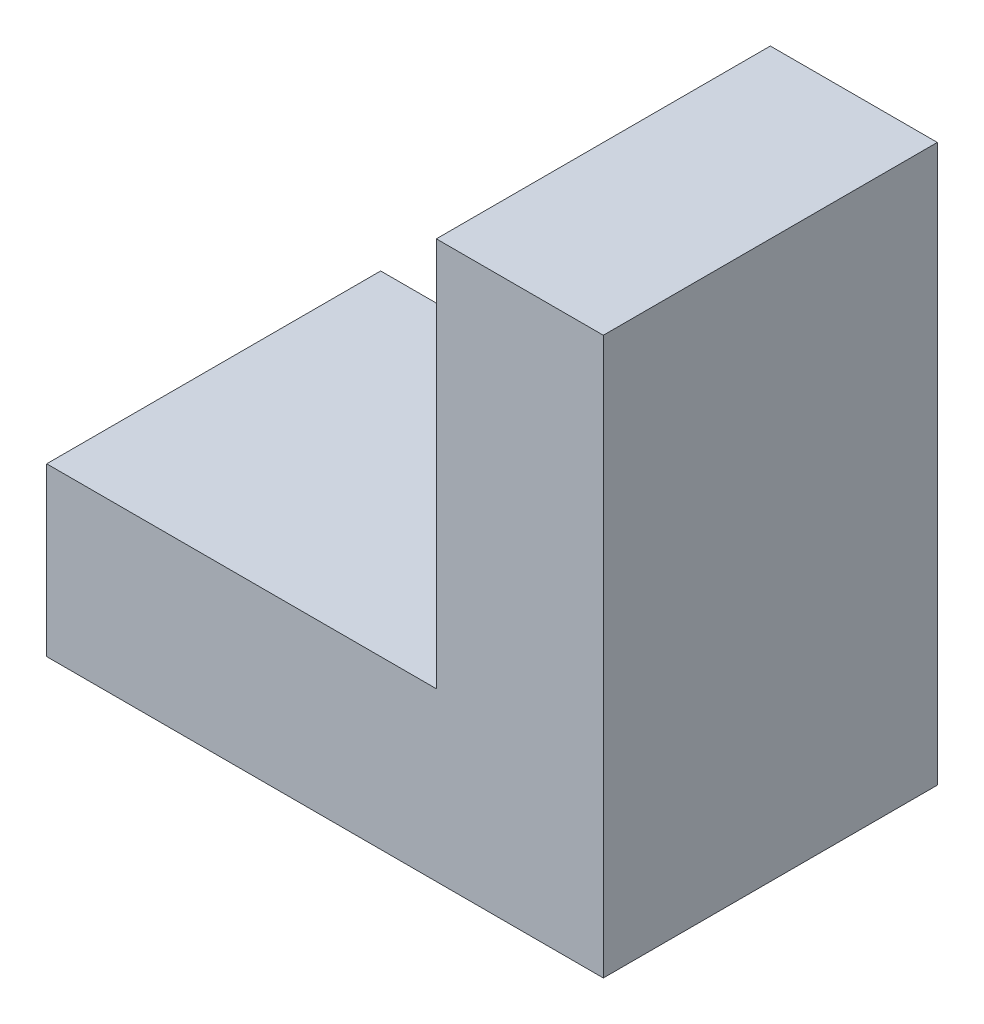
ISO-10303-21;
HEADER;
FILE_DESCRIPTION(('STEP AP214'),'2;1');
FILE_NAME('part.step','',(''),(''),'','','');
FILE_SCHEMA(('AUTOMOTIVE_DESIGN { 1 0 10303 214 1 1 1 1 }'));
ENDSEC;
DATA;
#1=APPLICATION_CONTEXT('core data for automotive mechanical design processes');
#2=APPLICATION_PROTOCOL_DEFINITION('international standard','automotive_design',2000,#1);
#3=PRODUCT_CONTEXT('',#1,'mechanical');
#4=PRODUCT('Part','Part','',(#3));
#5=PRODUCT_RELATED_PRODUCT_CATEGORY('part','',(#4));
#6=PRODUCT_DEFINITION_FORMATION('','',#4);
#7=PRODUCT_DEFINITION_CONTEXT('part definition',#1,'design');
#8=PRODUCT_DEFINITION('design','',#6,#7);
#9=PRODUCT_DEFINITION_SHAPE('','',#8);
#10=(LENGTH_UNIT() NAMED_UNIT(*) SI_UNIT(.MILLI.,.METRE.));
#11=(NAMED_UNIT(*) PLANE_ANGLE_UNIT() SI_UNIT($,.RADIAN.));
#12=(NAMED_UNIT(*) SI_UNIT($,.STERADIAN.) SOLID_ANGLE_UNIT());
#13=UNCERTAINTY_MEASURE_WITH_UNIT(LENGTH_MEASURE(1.E-05),#10,'distance_accuracy_value','');
#14=(GEOMETRIC_REPRESENTATION_CONTEXT(3) GLOBAL_UNCERTAINTY_ASSIGNED_CONTEXT((#13)) GLOBAL_UNIT_ASSIGNED_CONTEXT((#10,
#11,#12)) REPRESENTATION_CONTEXT('',''));
#15=CARTESIAN_POINT('',(0.,0.,0.));
#16=DIRECTION('',(0.,0.,1.));
#17=DIRECTION('',(1.,0.,0.));
#18=AXIS2_PLACEMENT_3D('',#15,#16,#17);
#19=CARTESIAN_POINT('',(-10.,6.,12.));
#20=DIRECTION('',(1.,0.,0.));
#21=DIRECTION('',(0.,0.,-1.));
#22=AXIS2_PLACEMENT_3D('',#19,#20,#21);
#23=PLANE('',#22);
#24=DIRECTION('',(0.,-1.,0.));
#25=VECTOR('',#24,1.);
#26=CARTESIAN_POINT('',(-10.,6.,0.));
#27=LINE('',#26,#25);
#28=CARTESIAN_POINT('',(-10.,6.,0.));
#29=VERTEX_POINT('',#28);
#30=CARTESIAN_POINT('',(-10.,0.,0.));
#31=VERTEX_POINT('',#30);
#32=EDGE_CURVE('E125',#29,#31,#27,.T.);
#33=ORIENTED_EDGE('',*,*,#32,.T.);
#34=DIRECTION('',(0.,0.,-1.));
#35=VECTOR('',#34,1.);
#36=CARTESIAN_POINT('',(-10.,0.,12.));
#37=LINE('',#36,#35);
#38=CARTESIAN_POINT('',(-10.,0.,12.));
#39=VERTEX_POINT('',#38);
#40=EDGE_CURVE('E11',#39,#31,#37,.T.);
#41=ORIENTED_EDGE('',*,*,#40,.F.);
#42=DIRECTION('',(0.,-1.,0.));
#43=VECTOR('',#42,1.);
#44=CARTESIAN_POINT('',(-10.,6.,12.));
#45=LINE('',#44,#43);
#46=CARTESIAN_POINT('',(-10.,6.,12.));
#47=VERTEX_POINT('',#46);
#48=EDGE_CURVE('E135',#47,#39,#45,.T.);
#49=ORIENTED_EDGE('',*,*,#48,.F.);
#50=DIRECTION('',(0.,0.,-1.));
#51=VECTOR('',#50,1.);
#52=CARTESIAN_POINT('',(-10.,6.,12.));
#53=LINE('',#52,#51);
#54=EDGE_CURVE('E121',#47,#29,#53,.T.);
#55=ORIENTED_EDGE('',*,*,#54,.T.);
#56=EDGE_LOOP('',(#33,#41,#49,#55));
#57=FACE_BOUND('',#56,.T.);
#58=ADVANCED_FACE('F41',(#57),#23,.F.);
#59=CARTESIAN_POINT('',(-10.,0.,12.));
#60=DIRECTION('',(0.,1.,0.));
#61=DIRECTION('',(0.,0.,1.));
#62=AXIS2_PLACEMENT_3D('',#59,#60,#61);
#63=PLANE('',#62);
#64=DIRECTION('',(1.,0.,0.));
#65=VECTOR('',#64,1.);
#66=CARTESIAN_POINT('',(-10.,0.,0.));
#67=LINE('',#66,#65);
#68=CARTESIAN_POINT('',(10.,0.,0.));
#69=VERTEX_POINT('',#68);
#70=EDGE_CURVE('E128',#31,#69,#67,.T.);
#71=ORIENTED_EDGE('',*,*,#70,.T.);
#72=DIRECTION('',(0.,0.,-1.));
#73=VECTOR('',#72,1.);
#74=CARTESIAN_POINT('',(10.,0.,12.));
#75=LINE('',#74,#73);
#76=CARTESIAN_POINT('',(10.,0.,12.));
#77=VERTEX_POINT('',#76);
#78=EDGE_CURVE('E49',#77,#69,#75,.T.);
#79=ORIENTED_EDGE('',*,*,#78,.F.);
#80=DIRECTION('',(1.,0.,0.));
#81=VECTOR('',#80,1.);
#82=CARTESIAN_POINT('',(-10.,0.,12.));
#83=LINE('',#82,#81);
#84=EDGE_CURVE('E94',#39,#77,#83,.T.);
#85=ORIENTED_EDGE('',*,*,#84,.F.);
#86=ORIENTED_EDGE('',*,*,#40,.T.);
#87=EDGE_LOOP('',(#71,#79,#85,#86));
#88=FACE_BOUND('',#87,.T.);
#89=ADVANCED_FACE('F159',(#88),#63,.F.);
#90=CARTESIAN_POINT('',(10.,0.,12.));
#91=DIRECTION('',(-1.,0.,0.));
#92=DIRECTION('',(0.,0.,1.));
#93=AXIS2_PLACEMENT_3D('',#90,#91,#92);
#94=PLANE('',#93);
#95=DIRECTION('',(0.,1.,0.));
#96=VECTOR('',#95,1.);
#97=CARTESIAN_POINT('',(10.,0.,0.));
#98=LINE('',#97,#96);
#99=CARTESIAN_POINT('',(10.,20.,0.));
#100=VERTEX_POINT('',#99);
#101=EDGE_CURVE('E130',#69,#100,#98,.T.);
#102=ORIENTED_EDGE('',*,*,#101,.T.);
#103=DIRECTION('',(0.,0.,-1.));
#104=VECTOR('',#103,1.);
#105=CARTESIAN_POINT('',(10.,20.,12.));
#106=LINE('',#105,#104);
#107=CARTESIAN_POINT('',(10.,20.,12.));
#108=VERTEX_POINT('',#107);
#109=EDGE_CURVE('E116',#108,#100,#106,.T.);
#110=ORIENTED_EDGE('',*,*,#109,.F.);
#111=DIRECTION('',(0.,1.,0.));
#112=VECTOR('',#111,1.);
#113=CARTESIAN_POINT('',(10.,0.,12.));
#114=LINE('',#113,#112);
#115=EDGE_CURVE('E107',#77,#108,#114,.T.);
#116=ORIENTED_EDGE('',*,*,#115,.F.);
#117=ORIENTED_EDGE('',*,*,#78,.T.);
#118=EDGE_LOOP('',(#102,#110,#116,#117));
#119=FACE_BOUND('',#118,.T.);
#120=ADVANCED_FACE('F141',(#119),#94,.F.);
#121=CARTESIAN_POINT('',(10.,20.,12.));
#122=DIRECTION('',(0.,-1.,0.));
#123=DIRECTION('',(0.,0.,-1.));
#124=AXIS2_PLACEMENT_3D('',#121,#122,#123);
#125=PLANE('',#124);
#126=DIRECTION('',(-1.,0.,0.));
#127=VECTOR('',#126,1.);
#128=CARTESIAN_POINT('',(10.,20.,0.));
#129=LINE('',#128,#127);
#130=CARTESIAN_POINT('',(4.,20.,0.));
#131=VERTEX_POINT('',#130);
#132=EDGE_CURVE('E115',#100,#131,#129,.T.);
#133=ORIENTED_EDGE('',*,*,#132,.T.);
#134=DIRECTION('',(0.,0.,-1.));
#135=VECTOR('',#134,1.);
#136=CARTESIAN_POINT('',(4.,20.,12.));
#137=LINE('',#136,#135);
#138=CARTESIAN_POINT('',(4.,20.,12.));
#139=VERTEX_POINT('',#138);
#140=EDGE_CURVE('E112',#139,#131,#137,.T.);
#141=ORIENTED_EDGE('',*,*,#140,.F.);
#142=DIRECTION('',(-1.,0.,0.));
#143=VECTOR('',#142,1.);
#144=CARTESIAN_POINT('',(10.,20.,12.));
#145=LINE('',#144,#143);
#146=EDGE_CURVE('E101',#108,#139,#145,.T.);
#147=ORIENTED_EDGE('',*,*,#146,.F.);
#148=ORIENTED_EDGE('',*,*,#109,.T.);
#149=EDGE_LOOP('',(#133,#141,#147,#148));
#150=FACE_BOUND('',#149,.T.);
#151=ADVANCED_FACE('F113',(#150),#125,.F.);
#152=CARTESIAN_POINT('',(4.,20.,12.));
#153=DIRECTION('',(1.,0.,0.));
#154=DIRECTION('',(0.,0.,-1.));
#155=AXIS2_PLACEMENT_3D('',#152,#153,#154);
#156=PLANE('',#155);
#157=DIRECTION('',(0.,-1.,0.));
#158=VECTOR('',#157,1.);
#159=CARTESIAN_POINT('',(4.,20.,0.));
#160=LINE('',#159,#158);
#161=CARTESIAN_POINT('',(4.,6.,0.));
#162=VERTEX_POINT('',#161);
#163=EDGE_CURVE('E80',#131,#162,#160,.T.);
#164=ORIENTED_EDGE('',*,*,#163,.T.);
#165=DIRECTION('',(0.,0.,-1.));
#166=VECTOR('',#165,1.);
#167=CARTESIAN_POINT('',(4.,6.,12.));
#168=LINE('',#167,#166);
#169=CARTESIAN_POINT('',(4.,6.,12.));
#170=VERTEX_POINT('',#169);
#171=EDGE_CURVE('E117',#170,#162,#168,.T.);
#172=ORIENTED_EDGE('',*,*,#171,.F.);
#173=DIRECTION('',(0.,-1.,0.));
#174=VECTOR('',#173,1.);
#175=CARTESIAN_POINT('',(4.,20.,12.));
#176=LINE('',#175,#174);
#177=EDGE_CURVE('E105',#139,#170,#176,.T.);
#178=ORIENTED_EDGE('',*,*,#177,.F.);
#179=ORIENTED_EDGE('',*,*,#140,.T.);
#180=EDGE_LOOP('',(#164,#172,#178,#179));
#181=FACE_BOUND('',#180,.T.);
#182=ADVANCED_FACE('F119',(#181),#156,.F.);
#183=CARTESIAN_POINT('',(4.,6.,12.));
#184=DIRECTION('',(0.,-1.,0.));
#185=DIRECTION('',(0.,0.,-1.));
#186=AXIS2_PLACEMENT_3D('',#183,#184,#185);
#187=PLANE('',#186);
#188=DIRECTION('',(-1.,0.,0.));
#189=VECTOR('',#188,1.);
#190=CARTESIAN_POINT('',(4.,6.,0.));
#191=LINE('',#190,#189);
#192=EDGE_CURVE('E86',#162,#29,#191,.T.);
#193=ORIENTED_EDGE('',*,*,#192,.T.);
#194=ORIENTED_EDGE('',*,*,#54,.F.);
#195=DIRECTION('',(-1.,0.,0.));
#196=VECTOR('',#195,1.);
#197=CARTESIAN_POINT('',(4.,6.,12.));
#198=LINE('',#197,#196);
#199=EDGE_CURVE('E57',#170,#47,#198,.T.);
#200=ORIENTED_EDGE('',*,*,#199,.F.);
#201=ORIENTED_EDGE('',*,*,#171,.T.);
#202=EDGE_LOOP('',(#193,#194,#200,#201));
#203=FACE_BOUND('',#202,.T.);
#204=ADVANCED_FACE('F148',(#203),#187,.F.);
#205=CARTESIAN_POINT('',(0.,0.,12.));
#206=DIRECTION('',(0.,0.,1.));
#207=DIRECTION('',(1.,0.,0.));
#208=AXIS2_PLACEMENT_3D('',#205,#206,#207);
#209=PLANE('',#208);
#210=ORIENTED_EDGE('',*,*,#48,.T.);
#211=ORIENTED_EDGE('',*,*,#84,.T.);
#212=ORIENTED_EDGE('',*,*,#115,.T.);
#213=ORIENTED_EDGE('',*,*,#146,.T.);
#214=ORIENTED_EDGE('',*,*,#177,.T.);
#215=ORIENTED_EDGE('',*,*,#199,.T.);
#216=EDGE_LOOP('',(#210,#211,#212,#213,#214,#215));
#217=FACE_BOUND('',#216,.T.);
#218=ADVANCED_FACE('F103',(#217),#209,.T.);
#219=CARTESIAN_POINT('',(0.,0.,0.));
#220=DIRECTION('',(0.,0.,1.));
#221=DIRECTION('',(1.,0.,0.));
#222=AXIS2_PLACEMENT_3D('',#219,#220,#221);
#223=PLANE('',#222);
#224=ORIENTED_EDGE('',*,*,#32,.F.);
#225=ORIENTED_EDGE('',*,*,#192,.F.);
#226=ORIENTED_EDGE('',*,*,#163,.F.);
#227=ORIENTED_EDGE('',*,*,#132,.F.);
#228=ORIENTED_EDGE('',*,*,#101,.F.);
#229=ORIENTED_EDGE('',*,*,#70,.F.);
#230=EDGE_LOOP('',(#224,#225,#226,#227,#228,#229));
#231=FACE_BOUND('',#230,.T.);
#232=ADVANCED_FACE('F144',(#231),#223,.F.);
#233=CLOSED_SHELL('',(#58,#89,#120,#151,#182,#204,#218,#232));
#234=MANIFOLD_SOLID_BREP('B2',#233);
#235=ADVANCED_BREP_SHAPE_REPRESENTATION('',(#18,#234),#14);
#236=SHAPE_DEFINITION_REPRESENTATION(#9,#235);
ENDSEC;
END-ISO-10303-21;
